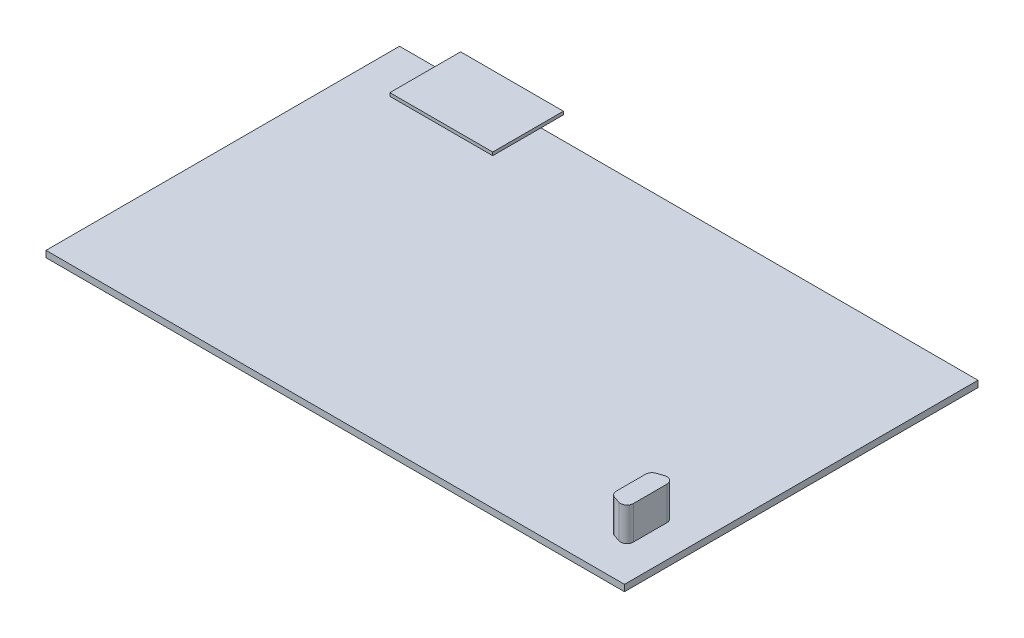
ISO-10303-21;
HEADER;
FILE_DESCRIPTION(('STEP AP214'),'2;1');
FILE_NAME('part.step','',(''),(''),'','','');
FILE_SCHEMA(('AUTOMOTIVE_DESIGN { 1 0 10303 214 1 1 1 1 }'));
ENDSEC;
DATA;
#1=APPLICATION_CONTEXT('core data for automotive mechanical design processes');
#2=APPLICATION_PROTOCOL_DEFINITION('international standard','automotive_design',2000,#1);
#3=PRODUCT_CONTEXT('',#1,'mechanical');
#4=PRODUCT('Part','Part','',(#3));
#5=PRODUCT_RELATED_PRODUCT_CATEGORY('part','',(#4));
#6=PRODUCT_DEFINITION_FORMATION('','',#4);
#7=PRODUCT_DEFINITION_CONTEXT('part definition',#1,'design');
#8=PRODUCT_DEFINITION('design','',#6,#7);
#9=PRODUCT_DEFINITION_SHAPE('','',#8);
#10=(LENGTH_UNIT() NAMED_UNIT(*) SI_UNIT(.MILLI.,.METRE.));
#11=(NAMED_UNIT(*) PLANE_ANGLE_UNIT() SI_UNIT($,.RADIAN.));
#12=(NAMED_UNIT(*) SI_UNIT($,.STERADIAN.) SOLID_ANGLE_UNIT());
#13=UNCERTAINTY_MEASURE_WITH_UNIT(LENGTH_MEASURE(1.E-05),#10,'distance_accuracy_value','');
#14=(GEOMETRIC_REPRESENTATION_CONTEXT(3) GLOBAL_UNCERTAINTY_ASSIGNED_CONTEXT((#13)) GLOBAL_UNIT_ASSIGNED_CONTEXT((#10,
#11,#12)) REPRESENTATION_CONTEXT('',''));
#15=CARTESIAN_POINT('',(0.,0.,0.));
#16=DIRECTION('',(0.,0.,1.));
#17=DIRECTION('',(1.,0.,0.));
#18=AXIS2_PLACEMENT_3D('',#15,#16,#17);
#19=CARTESIAN_POINT('',(0.,2.54,0.));
#20=DIRECTION('',(0.,1.,0.));
#21=DIRECTION('',(0.,0.,1.));
#22=AXIS2_PLACEMENT_3D('',#19,#20,#21);
#23=PLANE('',#22);
#24=DIRECTION('',(0.,0.,1.));
#25=VECTOR('',#24,1.);
#26=CARTESIAN_POINT('',(19.05,2.54,-158.75));
#27=LINE('',#26,#25);
#28=CARTESIAN_POINT('',(19.05,2.54,-158.75));
#29=VERTEX_POINT('',#28);
#30=CARTESIAN_POINT('',(19.05,2.54,-19.05));
#31=VERTEX_POINT('',#30);
#32=EDGE_CURVE('E234',#29,#31,#27,.T.);
#33=ORIENTED_EDGE('',*,*,#32,.T.);
#34=DIRECTION('',(1.,0.,0.));
#35=VECTOR('',#34,1.);
#36=CARTESIAN_POINT('',(19.05,2.54,-19.05));
#37=LINE('',#36,#35);
#38=CARTESIAN_POINT('',(247.65,2.54,-19.05));
#39=VERTEX_POINT('',#38);
#40=EDGE_CURVE('E237',#31,#39,#37,.T.);
#41=ORIENTED_EDGE('',*,*,#40,.T.);
#42=DIRECTION('',(0.,0.,-1.));
#43=VECTOR('',#42,1.);
#44=CARTESIAN_POINT('',(247.65,2.54,-158.75));
#45=LINE('',#44,#43);
#46=CARTESIAN_POINT('',(247.65,2.54,-158.75));
#47=VERTEX_POINT('',#46);
#48=EDGE_CURVE('E240',#39,#47,#45,.T.);
#49=ORIENTED_EDGE('',*,*,#48,.T.);
#50=DIRECTION('',(-1.,0.,0.));
#51=VECTOR('',#50,1.);
#52=CARTESIAN_POINT('',(19.05,2.54,-158.75));
#53=LINE('',#52,#51);
#54=EDGE_CURVE('E242',#47,#29,#53,.T.);
#55=ORIENTED_EDGE('',*,*,#54,.T.);
#56=EDGE_LOOP('',(#33,#41,#49,#55));
#57=FACE_BOUND('',#56,.T.);
#58=DIRECTION('',(1.,0.,0.));
#59=VECTOR('',#58,1.);
#60=CARTESIAN_POINT('',(40.64,2.54,-143.51));
#61=LINE('',#60,#59);
#62=CARTESIAN_POINT('',(40.64,2.54,-143.51));
#63=VERTEX_POINT('',#62);
#64=CARTESIAN_POINT('',(73.66,2.54,-143.51));
#65=VERTEX_POINT('',#64);
#66=EDGE_CURVE('E199',#63,#65,#61,.T.);
#67=ORIENTED_EDGE('',*,*,#66,.F.);
#68=DIRECTION('',(0.,0.,1.));
#69=VECTOR('',#68,1.);
#70=CARTESIAN_POINT('',(40.64,2.54,-148.59));
#71=LINE('',#70,#69);
#72=CARTESIAN_POINT('',(40.64,2.54,-148.59));
#73=VERTEX_POINT('',#72);
#74=EDGE_CURVE('E196',#73,#63,#71,.T.);
#75=ORIENTED_EDGE('',*,*,#74,.F.);
#76=DIRECTION('',(-1.,0.,0.));
#77=VECTOR('',#76,1.);
#78=CARTESIAN_POINT('',(40.64,2.54,-148.59));
#79=LINE('',#78,#77);
#80=CARTESIAN_POINT('',(73.66,2.54,-148.59));
#81=VERTEX_POINT('',#80);
#82=EDGE_CURVE('E209',#81,#73,#79,.T.);
#83=ORIENTED_EDGE('',*,*,#82,.F.);
#84=DIRECTION('',(0.,0.,-1.));
#85=VECTOR('',#84,1.);
#86=CARTESIAN_POINT('',(73.66,2.54,-148.59));
#87=LINE('',#86,#85);
#88=EDGE_CURVE('E220',#65,#81,#87,.T.);
#89=ORIENTED_EDGE('',*,*,#88,.F.);
#90=EDGE_LOOP('',(#67,#75,#83,#89));
#91=FACE_BOUND('',#90,.T.);
#92=DIRECTION('',(0.948683298050514,0.,0.316227766016838));
#93=VECTOR('',#92,1.);
#94=CARTESIAN_POINT('',(234.95,2.54,-31.75));
#95=LINE('',#94,#93);
#96=CARTESIAN_POINT('',(229.066781474317,2.54,-33.7110728418943));
#97=VERTEX_POINT('',#96);
#98=CARTESIAN_POINT('',(231.606781474317,2.54,-32.8644061752276));
#99=VERTEX_POINT('',#98);
#100=EDGE_CURVE('E296',#97,#99,#95,.T.);
#101=ORIENTED_EDGE('',*,*,#100,.F.);
#102=CARTESIAN_POINT('',(229.87,2.54,-36.1207284189426));
#103=DIRECTION('',(0.,1.,0.));
#104=DIRECTION('',(0.,0.,1.));
#105=AXIS2_PLACEMENT_3D('',#102,#103,#104);
#106=CIRCLE('',#105,2.54);
#107=CARTESIAN_POINT('',(227.33,2.54,-36.1207284189426));
#108=VERTEX_POINT('',#107);
#109=EDGE_CURVE('E43',#97,#108,#106,.F.);
#110=ORIENTED_EDGE('',*,*,#109,.T.);
#111=DIRECTION('',(0.,0.,1.));
#112=VECTOR('',#111,1.);
#113=CARTESIAN_POINT('',(227.33,2.54,-34.29));
#114=LINE('',#113,#112);
#115=CARTESIAN_POINT('',(227.33,2.54,-47.6992715810574));
#116=VERTEX_POINT('',#115);
#117=EDGE_CURVE('E295',#116,#108,#114,.T.);
#118=ORIENTED_EDGE('',*,*,#117,.F.);
#119=CARTESIAN_POINT('',(229.87,2.54,-47.6992715810574));
#120=DIRECTION('',(0.,1.,0.));
#121=DIRECTION('',(0.,0.,1.));
#122=AXIS2_PLACEMENT_3D('',#119,#120,#121);
#123=CIRCLE('',#122,2.54);
#124=CARTESIAN_POINT('',(229.066781474317,2.54,-50.1089271581057));
#125=VERTEX_POINT('',#124);
#126=EDGE_CURVE('E290',#116,#125,#123,.F.);
#127=ORIENTED_EDGE('',*,*,#126,.T.);
#128=DIRECTION('',(-0.948683298050513,0.,0.316227766016839));
#129=VECTOR('',#128,1.);
#130=CARTESIAN_POINT('',(227.33,2.54,-49.53));
#131=LINE('',#130,#129);
#132=CARTESIAN_POINT('',(231.606781474317,2.54,-50.9555938247724));
#133=VERTEX_POINT('',#132);
#134=EDGE_CURVE('E321',#133,#125,#131,.T.);
#135=ORIENTED_EDGE('',*,*,#134,.F.);
#136=CARTESIAN_POINT('',(232.41,2.54,-48.5459382477241));
#137=DIRECTION('',(0.,1.,0.));
#138=DIRECTION('',(0.,0.,1.));
#139=AXIS2_PLACEMENT_3D('',#136,#137,#138);
#140=CIRCLE('',#139,2.54);
#141=CARTESIAN_POINT('',(234.95,2.54,-48.5459382477241));
#142=VERTEX_POINT('',#141);
#143=EDGE_CURVE('E292',#133,#142,#140,.F.);
#144=ORIENTED_EDGE('',*,*,#143,.T.);
#145=DIRECTION('',(0.,0.,-1.));
#146=VECTOR('',#145,1.);
#147=CARTESIAN_POINT('',(234.95,2.54,-52.07));
#148=LINE('',#147,#146);
#149=CARTESIAN_POINT('',(234.95,2.54,-35.2740617522759));
#150=VERTEX_POINT('',#149);
#151=EDGE_CURVE('E326',#150,#142,#148,.T.);
#152=ORIENTED_EDGE('',*,*,#151,.F.);
#153=CARTESIAN_POINT('',(232.41,2.54,-35.2740617522759));
#154=DIRECTION('',(0.,1.,0.));
#155=DIRECTION('',(0.,0.,1.));
#156=AXIS2_PLACEMENT_3D('',#153,#154,#155);
#157=CIRCLE('',#156,2.54);
#158=EDGE_CURVE('E11',#150,#99,#157,.F.);
#159=ORIENTED_EDGE('',*,*,#158,.T.);
#160=EDGE_LOOP('',(#101,#110,#118,#127,#135,#144,#152,#159));
#161=FACE_BOUND('',#160,.T.);
#162=ADVANCED_FACE('F35',(#57,#91,#161),#23,.T.);
#163=CARTESIAN_POINT('',(19.05,2.54,-158.75));
#164=DIRECTION('',(1.,0.,0.));
#165=DIRECTION('',(0.,0.,-1.));
#166=AXIS2_PLACEMENT_3D('',#163,#164,#165);
#167=PLANE('',#166);
#168=DIRECTION('',(0.,0.,1.));
#169=VECTOR('',#168,1.);
#170=CARTESIAN_POINT('',(19.05,0.,-158.75));
#171=LINE('',#170,#169);
#172=CARTESIAN_POINT('',(19.05,0.,-158.75));
#173=VERTEX_POINT('',#172);
#174=CARTESIAN_POINT('',(19.05,0.,-19.05));
#175=VERTEX_POINT('',#174);
#176=EDGE_CURVE('E233',#173,#175,#171,.T.);
#177=ORIENTED_EDGE('',*,*,#176,.T.);
#178=DIRECTION('',(0.,-1.,0.));
#179=VECTOR('',#178,1.);
#180=CARTESIAN_POINT('',(19.05,2.54,-19.05));
#181=LINE('',#180,#179);
#182=EDGE_CURVE('E260',#31,#175,#181,.T.);
#183=ORIENTED_EDGE('',*,*,#182,.F.);
#184=ORIENTED_EDGE('',*,*,#32,.F.);
#185=DIRECTION('',(0.,-1.,0.));
#186=VECTOR('',#185,1.);
#187=CARTESIAN_POINT('',(19.05,2.54,-158.75));
#188=LINE('',#187,#186);
#189=EDGE_CURVE('E244',#29,#173,#188,.T.);
#190=ORIENTED_EDGE('',*,*,#189,.T.);
#191=EDGE_LOOP('',(#177,#183,#184,#190));
#192=FACE_BOUND('',#191,.T.);
#193=ADVANCED_FACE('F360',(#192),#167,.F.);
#194=CARTESIAN_POINT('',(19.05,2.54,-19.05));
#195=DIRECTION('',(0.,0.,-1.));
#196=DIRECTION('',(-1.,0.,0.));
#197=AXIS2_PLACEMENT_3D('',#194,#195,#196);
#198=PLANE('',#197);
#199=DIRECTION('',(1.,0.,0.));
#200=VECTOR('',#199,1.);
#201=CARTESIAN_POINT('',(19.05,0.,-19.05));
#202=LINE('',#201,#200);
#203=CARTESIAN_POINT('',(247.65,0.,-19.05));
#204=VERTEX_POINT('',#203);
#205=EDGE_CURVE('E247',#175,#204,#202,.T.);
#206=ORIENTED_EDGE('',*,*,#205,.T.);
#207=DIRECTION('',(0.,-1.,0.));
#208=VECTOR('',#207,1.);
#209=CARTESIAN_POINT('',(247.65,2.54,-19.05));
#210=LINE('',#209,#208);
#211=EDGE_CURVE('E257',#39,#204,#210,.T.);
#212=ORIENTED_EDGE('',*,*,#211,.F.);
#213=ORIENTED_EDGE('',*,*,#40,.F.);
#214=ORIENTED_EDGE('',*,*,#182,.T.);
#215=EDGE_LOOP('',(#206,#212,#213,#214));
#216=FACE_BOUND('',#215,.T.);
#217=ADVANCED_FACE('F366',(#216),#198,.F.);
#218=CARTESIAN_POINT('',(247.65,2.54,-158.75));
#219=DIRECTION('',(-1.,0.,0.));
#220=DIRECTION('',(0.,0.,1.));
#221=AXIS2_PLACEMENT_3D('',#218,#219,#220);
#222=PLANE('',#221);
#223=DIRECTION('',(0.,0.,-1.));
#224=VECTOR('',#223,1.);
#225=CARTESIAN_POINT('',(247.65,0.,-158.75));
#226=LINE('',#225,#224);
#227=CARTESIAN_POINT('',(247.65,0.,-158.75));
#228=VERTEX_POINT('',#227);
#229=EDGE_CURVE('E249',#204,#228,#226,.T.);
#230=ORIENTED_EDGE('',*,*,#229,.T.);
#231=DIRECTION('',(0.,-1.,0.));
#232=VECTOR('',#231,1.);
#233=CARTESIAN_POINT('',(247.65,2.54,-158.75));
#234=LINE('',#233,#232);
#235=EDGE_CURVE('E254',#47,#228,#234,.T.);
#236=ORIENTED_EDGE('',*,*,#235,.F.);
#237=ORIENTED_EDGE('',*,*,#48,.F.);
#238=ORIENTED_EDGE('',*,*,#211,.T.);
#239=EDGE_LOOP('',(#230,#236,#237,#238));
#240=FACE_BOUND('',#239,.T.);
#241=ADVANCED_FACE('F381',(#240),#222,.F.);
#242=CARTESIAN_POINT('',(19.05,2.54,-158.75));
#243=DIRECTION('',(0.,0.,1.));
#244=DIRECTION('',(1.,0.,0.));
#245=AXIS2_PLACEMENT_3D('',#242,#243,#244);
#246=PLANE('',#245);
#247=DIRECTION('',(-1.,0.,0.));
#248=VECTOR('',#247,1.);
#249=CARTESIAN_POINT('',(19.05,0.,-158.75));
#250=LINE('',#249,#248);
#251=EDGE_CURVE('E238',#228,#173,#250,.T.);
#252=ORIENTED_EDGE('',*,*,#251,.T.);
#253=ORIENTED_EDGE('',*,*,#189,.F.);
#254=ORIENTED_EDGE('',*,*,#54,.F.);
#255=ORIENTED_EDGE('',*,*,#235,.T.);
#256=EDGE_LOOP('',(#252,#253,#254,#255));
#257=FACE_BOUND('',#256,.T.);
#258=ADVANCED_FACE('F377',(#257),#246,.F.);
#259=CARTESIAN_POINT('',(0.,0.,0.));
#260=DIRECTION('',(0.,1.,0.));
#261=DIRECTION('',(0.,0.,1.));
#262=AXIS2_PLACEMENT_3D('',#259,#260,#261);
#263=PLANE('',#262);
#264=ORIENTED_EDGE('',*,*,#176,.F.);
#265=ORIENTED_EDGE('',*,*,#251,.F.);
#266=ORIENTED_EDGE('',*,*,#229,.F.);
#267=ORIENTED_EDGE('',*,*,#205,.F.);
#268=EDGE_LOOP('',(#264,#265,#266,#267));
#269=FACE_BOUND('',#268,.T.);
#270=ADVANCED_FACE('F374',(#269),#263,.F.);
#271=CARTESIAN_POINT('',(40.64,5.08,-148.59));
#272=DIRECTION('',(1.,0.,0.));
#273=DIRECTION('',(0.,0.,-1.));
#274=AXIS2_PLACEMENT_3D('',#271,#272,#273);
#275=PLANE('',#274);
#276=ORIENTED_EDGE('',*,*,#74,.T.);
#277=DIRECTION('',(0.,-1.,0.));
#278=VECTOR('',#277,1.);
#279=CARTESIAN_POINT('',(40.64,5.08,-143.51));
#280=LINE('',#279,#278);
#281=CARTESIAN_POINT('',(40.64,5.08,-143.51));
#282=VERTEX_POINT('',#281);
#283=EDGE_CURVE('E231',#282,#63,#280,.T.);
#284=ORIENTED_EDGE('',*,*,#283,.F.);
#285=DIRECTION('',(0.,0.,1.));
#286=VECTOR('',#285,1.);
#287=CARTESIAN_POINT('',(40.64,5.08,-148.59));
#288=LINE('',#287,#286);
#289=CARTESIAN_POINT('',(40.64,5.08,-148.59));
#290=VERTEX_POINT('',#289);
#291=EDGE_CURVE('E205',#290,#282,#288,.T.);
#292=ORIENTED_EDGE('',*,*,#291,.F.);
#293=DIRECTION('',(0.,-1.,0.));
#294=VECTOR('',#293,1.);
#295=CARTESIAN_POINT('',(40.64,5.08,-148.59));
#296=LINE('',#295,#294);
#297=EDGE_CURVE('E217',#290,#73,#296,.T.);
#298=ORIENTED_EDGE('',*,*,#297,.T.);
#299=EDGE_LOOP('',(#276,#284,#292,#298));
#300=FACE_BOUND('',#299,.T.);
#301=ADVANCED_FACE('F372',(#300),#275,.F.);
#302=CARTESIAN_POINT('',(40.64,5.08,-143.51));
#303=DIRECTION('',(0.,0.,-1.));
#304=DIRECTION('',(-1.,0.,0.));
#305=AXIS2_PLACEMENT_3D('',#302,#303,#304);
#306=PLANE('',#305);
#307=ORIENTED_EDGE('',*,*,#66,.T.);
#308=DIRECTION('',(0.,-1.,0.));
#309=VECTOR('',#308,1.);
#310=CARTESIAN_POINT('',(73.66,5.08,-143.51));
#311=LINE('',#310,#309);
#312=CARTESIAN_POINT('',(73.66,5.08,-143.51));
#313=VERTEX_POINT('',#312);
#314=EDGE_CURVE('E228',#313,#65,#311,.T.);
#315=ORIENTED_EDGE('',*,*,#314,.F.);
#316=DIRECTION('',(1.,0.,0.));
#317=VECTOR('',#316,1.);
#318=CARTESIAN_POINT('',(40.64,5.08,-143.51));
#319=LINE('',#318,#317);
#320=EDGE_CURVE('E208',#282,#313,#319,.T.);
#321=ORIENTED_EDGE('',*,*,#320,.F.);
#322=ORIENTED_EDGE('',*,*,#283,.T.);
#323=EDGE_LOOP('',(#307,#315,#321,#322));
#324=FACE_BOUND('',#323,.T.);
#325=ADVANCED_FACE('F444',(#324),#306,.F.);
#326=CARTESIAN_POINT('',(73.66,5.08,-148.59));
#327=DIRECTION('',(-1.,0.,0.));
#328=DIRECTION('',(0.,0.,1.));
#329=AXIS2_PLACEMENT_3D('',#326,#327,#328);
#330=PLANE('',#329);
#331=ORIENTED_EDGE('',*,*,#88,.T.);
#332=DIRECTION('',(0.,-1.,0.));
#333=VECTOR('',#332,1.);
#334=CARTESIAN_POINT('',(73.66,5.08,-148.59));
#335=LINE('',#334,#333);
#336=CARTESIAN_POINT('',(73.66,5.08,-148.59));
#337=VERTEX_POINT('',#336);
#338=EDGE_CURVE('E226',#337,#81,#335,.T.);
#339=ORIENTED_EDGE('',*,*,#338,.F.);
#340=DIRECTION('',(0.,0.,-1.));
#341=VECTOR('',#340,1.);
#342=CARTESIAN_POINT('',(73.66,5.08,-148.59));
#343=LINE('',#342,#341);
#344=EDGE_CURVE('E212',#313,#337,#343,.T.);
#345=ORIENTED_EDGE('',*,*,#344,.F.);
#346=ORIENTED_EDGE('',*,*,#314,.T.);
#347=EDGE_LOOP('',(#331,#339,#345,#346));
#348=FACE_BOUND('',#347,.T.);
#349=ADVANCED_FACE('F438',(#348),#330,.F.);
#350=CARTESIAN_POINT('',(40.64,5.08,-148.59));
#351=DIRECTION('',(0.,0.,1.));
#352=DIRECTION('',(1.,0.,0.));
#353=AXIS2_PLACEMENT_3D('',#350,#351,#352);
#354=PLANE('',#353);
#355=ORIENTED_EDGE('',*,*,#82,.T.);
#356=ORIENTED_EDGE('',*,*,#297,.F.);
#357=DIRECTION('',(-1.,0.,0.));
#358=VECTOR('',#357,1.);
#359=CARTESIAN_POINT('',(40.64,5.08,-148.59));
#360=LINE('',#359,#358);
#361=EDGE_CURVE('E215',#337,#290,#360,.T.);
#362=ORIENTED_EDGE('',*,*,#361,.F.);
#363=ORIENTED_EDGE('',*,*,#338,.T.);
#364=EDGE_LOOP('',(#355,#356,#362,#363));
#365=FACE_BOUND('',#364,.T.);
#366=ADVANCED_FACE('F432',(#365),#354,.F.);
#367=CARTESIAN_POINT('',(0.,5.08,0.));
#368=DIRECTION('',(0.,1.,0.));
#369=DIRECTION('',(0.,0.,1.));
#370=AXIS2_PLACEMENT_3D('',#367,#368,#369);
#371=PLANE('',#370);
#372=DIRECTION('',(0.,0.,1.));
#373=VECTOR('',#372,1.);
#374=CARTESIAN_POINT('',(36.83,5.08,-165.1));
#375=LINE('',#374,#373);
#376=CARTESIAN_POINT('',(36.83,5.08,-165.1));
#377=VERTEX_POINT('',#376);
#378=CARTESIAN_POINT('',(36.83,5.08,-137.16));
#379=VERTEX_POINT('',#378);
#380=EDGE_CURVE('E195',#377,#379,#375,.T.);
#381=ORIENTED_EDGE('',*,*,#380,.F.);
#382=DIRECTION('',(-1.,0.,0.));
#383=VECTOR('',#382,1.);
#384=CARTESIAN_POINT('',(36.83,5.08,-165.1));
#385=LINE('',#384,#383);
#386=CARTESIAN_POINT('',(77.47,5.08,-165.1));
#387=VERTEX_POINT('',#386);
#388=EDGE_CURVE('E191',#387,#377,#385,.T.);
#389=ORIENTED_EDGE('',*,*,#388,.F.);
#390=DIRECTION('',(0.,0.,-1.));
#391=VECTOR('',#390,1.);
#392=CARTESIAN_POINT('',(77.47,5.08,-165.1));
#393=LINE('',#392,#391);
#394=CARTESIAN_POINT('',(77.47,5.08,-137.16));
#395=VERTEX_POINT('',#394);
#396=EDGE_CURVE('E337',#395,#387,#393,.T.);
#397=ORIENTED_EDGE('',*,*,#396,.F.);
#398=DIRECTION('',(1.,0.,0.));
#399=VECTOR('',#398,1.);
#400=CARTESIAN_POINT('',(36.83,5.08,-137.16));
#401=LINE('',#400,#399);
#402=EDGE_CURVE('E335',#379,#395,#401,.T.);
#403=ORIENTED_EDGE('',*,*,#402,.F.);
#404=EDGE_LOOP('',(#381,#389,#397,#403));
#405=FACE_BOUND('',#404,.T.);
#406=ORIENTED_EDGE('',*,*,#361,.T.);
#407=ORIENTED_EDGE('',*,*,#291,.T.);
#408=ORIENTED_EDGE('',*,*,#320,.T.);
#409=ORIENTED_EDGE('',*,*,#344,.T.);
#410=EDGE_LOOP('',(#406,#407,#408,#409));
#411=FACE_BOUND('',#410,.T.);
#412=ADVANCED_FACE('F348',(#405,#411),#371,.F.);
#413=CARTESIAN_POINT('',(36.83,6.35,-165.1));
#414=DIRECTION('',(1.,0.,0.));
#415=DIRECTION('',(0.,0.,-1.));
#416=AXIS2_PLACEMENT_3D('',#413,#414,#415);
#417=PLANE('',#416);
#418=ORIENTED_EDGE('',*,*,#380,.T.);
#419=DIRECTION('',(0.,-1.,0.));
#420=VECTOR('',#419,1.);
#421=CARTESIAN_POINT('',(36.83,6.35,-137.16));
#422=LINE('',#421,#420);
#423=CARTESIAN_POINT('',(36.83,6.35,-137.16));
#424=VERTEX_POINT('',#423);
#425=EDGE_CURVE('E175',#424,#379,#422,.T.);
#426=ORIENTED_EDGE('',*,*,#425,.F.);
#427=DIRECTION('',(0.,0.,1.));
#428=VECTOR('',#427,1.);
#429=CARTESIAN_POINT('',(36.83,6.35,-165.1));
#430=LINE('',#429,#428);
#431=CARTESIAN_POINT('',(36.83,6.35,-165.1));
#432=VERTEX_POINT('',#431);
#433=EDGE_CURVE('E182',#432,#424,#430,.T.);
#434=ORIENTED_EDGE('',*,*,#433,.F.);
#435=DIRECTION('',(0.,-1.,0.));
#436=VECTOR('',#435,1.);
#437=CARTESIAN_POINT('',(36.83,6.35,-165.1));
#438=LINE('',#437,#436);
#439=EDGE_CURVE('E333',#432,#377,#438,.T.);
#440=ORIENTED_EDGE('',*,*,#439,.T.);
#441=EDGE_LOOP('',(#418,#426,#434,#440));
#442=FACE_BOUND('',#441,.T.);
#443=ADVANCED_FACE('F193',(#442),#417,.F.);
#444=CARTESIAN_POINT('',(36.83,6.35,-137.16));
#445=DIRECTION('',(0.,0.,-1.));
#446=DIRECTION('',(-1.,0.,0.));
#447=AXIS2_PLACEMENT_3D('',#444,#445,#446);
#448=PLANE('',#447);
#449=ORIENTED_EDGE('',*,*,#402,.T.);
#450=DIRECTION('',(0.,-1.,0.));
#451=VECTOR('',#450,1.);
#452=CARTESIAN_POINT('',(77.47,6.35,-137.16));
#453=LINE('',#452,#451);
#454=CARTESIAN_POINT('',(77.47,6.35,-137.16));
#455=VERTEX_POINT('',#454);
#456=EDGE_CURVE('E178',#455,#395,#453,.T.);
#457=ORIENTED_EDGE('',*,*,#456,.F.);
#458=DIRECTION('',(1.,0.,0.));
#459=VECTOR('',#458,1.);
#460=CARTESIAN_POINT('',(36.83,6.35,-137.16));
#461=LINE('',#460,#459);
#462=EDGE_CURVE('E171',#424,#455,#461,.T.);
#463=ORIENTED_EDGE('',*,*,#462,.F.);
#464=ORIENTED_EDGE('',*,*,#425,.T.);
#465=EDGE_LOOP('',(#449,#457,#463,#464));
#466=FACE_BOUND('',#465,.T.);
#467=ADVANCED_FACE('F173',(#466),#448,.F.);
#468=CARTESIAN_POINT('',(77.47,6.35,-165.1));
#469=DIRECTION('',(-1.,0.,0.));
#470=DIRECTION('',(0.,0.,1.));
#471=AXIS2_PLACEMENT_3D('',#468,#469,#470);
#472=PLANE('',#471);
#473=ORIENTED_EDGE('',*,*,#396,.T.);
#474=DIRECTION('',(0.,-1.,0.));
#475=VECTOR('',#474,1.);
#476=CARTESIAN_POINT('',(77.47,6.35,-165.1));
#477=LINE('',#476,#475);
#478=CARTESIAN_POINT('',(77.47,6.35,-165.1));
#479=VERTEX_POINT('',#478);
#480=EDGE_CURVE('E201',#479,#387,#477,.T.);
#481=ORIENTED_EDGE('',*,*,#480,.F.);
#482=DIRECTION('',(0.,0.,-1.));
#483=VECTOR('',#482,1.);
#484=CARTESIAN_POINT('',(77.47,6.35,-165.1));
#485=LINE('',#484,#483);
#486=EDGE_CURVE('E181',#455,#479,#485,.T.);
#487=ORIENTED_EDGE('',*,*,#486,.F.);
#488=ORIENTED_EDGE('',*,*,#456,.T.);
#489=EDGE_LOOP('',(#473,#481,#487,#488));
#490=FACE_BOUND('',#489,.T.);
#491=ADVANCED_FACE('F350',(#490),#472,.F.);
#492=CARTESIAN_POINT('',(36.83,6.35,-165.1));
#493=DIRECTION('',(0.,0.,1.));
#494=DIRECTION('',(1.,0.,0.));
#495=AXIS2_PLACEMENT_3D('',#492,#493,#494);
#496=PLANE('',#495);
#497=ORIENTED_EDGE('',*,*,#388,.T.);
#498=ORIENTED_EDGE('',*,*,#439,.F.);
#499=DIRECTION('',(-1.,0.,0.));
#500=VECTOR('',#499,1.);
#501=CARTESIAN_POINT('',(36.83,6.35,-165.1));
#502=LINE('',#501,#500);
#503=EDGE_CURVE('E187',#479,#432,#502,.T.);
#504=ORIENTED_EDGE('',*,*,#503,.F.);
#505=ORIENTED_EDGE('',*,*,#480,.T.);
#506=EDGE_LOOP('',(#497,#498,#504,#505));
#507=FACE_BOUND('',#506,.T.);
#508=ADVANCED_FACE('F344',(#507),#496,.F.);
#509=CARTESIAN_POINT('',(0.,6.35,0.));
#510=DIRECTION('',(0.,1.,0.));
#511=DIRECTION('',(0.,0.,1.));
#512=AXIS2_PLACEMENT_3D('',#509,#510,#511);
#513=PLANE('',#512);
#514=ORIENTED_EDGE('',*,*,#433,.T.);
#515=ORIENTED_EDGE('',*,*,#462,.T.);
#516=ORIENTED_EDGE('',*,*,#486,.T.);
#517=ORIENTED_EDGE('',*,*,#503,.T.);
#518=EDGE_LOOP('',(#514,#515,#516,#517));
#519=FACE_BOUND('',#518,.T.);
#520=ADVANCED_FACE('F185',(#519),#513,.T.);
#521=CARTESIAN_POINT('',(227.33,15.748,-34.29));
#522=DIRECTION('',(1.,0.,0.));
#523=DIRECTION('',(0.,0.,-1.));
#524=AXIS2_PLACEMENT_3D('',#521,#522,#523);
#525=PLANE('',#524);
#526=DIRECTION('',(0.,0.,1.));
#527=VECTOR('',#526,1.);
#528=CARTESIAN_POINT('',(227.33,15.748,-34.29));
#529=LINE('',#528,#527);
#530=CARTESIAN_POINT('',(227.33,15.748,-47.6992715810574));
#531=VERTEX_POINT('',#530);
#532=CARTESIAN_POINT('',(227.33,15.748,-36.1207284189426));
#533=VERTEX_POINT('',#532);
#534=EDGE_CURVE('E312',#531,#533,#529,.T.);
#535=ORIENTED_EDGE('',*,*,#534,.F.);
#536=DIRECTION('',(0.,-1.,0.));
#537=VECTOR('',#536,1.);
#538=CARTESIAN_POINT('',(227.33,15.748,-47.6992715810574));
#539=LINE('',#538,#537);
#540=EDGE_CURVE('E265',#531,#116,#539,.T.);
#541=ORIENTED_EDGE('',*,*,#540,.T.);
#542=ORIENTED_EDGE('',*,*,#117,.T.);
#543=DIRECTION('',(0.,-1.,0.));
#544=VECTOR('',#543,1.);
#545=CARTESIAN_POINT('',(227.33,15.748,-36.1207284189426));
#546=LINE('',#545,#544);
#547=EDGE_CURVE('E263',#108,#533,#546,.F.);
#548=ORIENTED_EDGE('',*,*,#547,.T.);
#549=EDGE_LOOP('',(#535,#541,#542,#548));
#550=FACE_BOUND('',#549,.T.);
#551=ADVANCED_FACE('F299',(#550),#525,.F.);
#552=CARTESIAN_POINT('',(234.95,15.748,-31.75));
#553=DIRECTION('',(0.316227766016838,0.,-0.948683298050514));
#554=DIRECTION('',(-0.948683298050514,0.,-0.316227766016838));
#555=AXIS2_PLACEMENT_3D('',#552,#553,#554);
#556=PLANE('',#555);
#557=DIRECTION('',(0.948683298050514,0.,0.316227766016838));
#558=VECTOR('',#557,1.);
#559=CARTESIAN_POINT('',(234.95,15.748,-31.75));
#560=LINE('',#559,#558);
#561=CARTESIAN_POINT('',(229.066781474317,15.748,-33.7110728418943));
#562=VERTEX_POINT('',#561);
#563=CARTESIAN_POINT('',(231.606781474317,15.748,-32.8644061752276));
#564=VERTEX_POINT('',#563);
#565=EDGE_CURVE('E310',#562,#564,#560,.T.);
#566=ORIENTED_EDGE('',*,*,#565,.F.);
#567=DIRECTION('',(0.,-1.,0.));
#568=VECTOR('',#567,1.);
#569=CARTESIAN_POINT('',(229.066781474317,15.748,-33.7110728418943));
#570=LINE('',#569,#568);
#571=EDGE_CURVE('E288',#562,#97,#570,.T.);
#572=ORIENTED_EDGE('',*,*,#571,.T.);
#573=ORIENTED_EDGE('',*,*,#100,.T.);
#574=DIRECTION('',(0.,-1.,0.));
#575=VECTOR('',#574,1.);
#576=CARTESIAN_POINT('',(231.606781474317,15.748,-32.8644061752276));
#577=LINE('',#576,#575);
#578=EDGE_CURVE('E286',#99,#564,#577,.F.);
#579=ORIENTED_EDGE('',*,*,#578,.T.);
#580=EDGE_LOOP('',(#566,#572,#573,#579));
#581=FACE_BOUND('',#580,.T.);
#582=ADVANCED_FACE('F314',(#581),#556,.F.);
#583=CARTESIAN_POINT('',(234.95,15.748,-52.07));
#584=DIRECTION('',(-1.,0.,0.));
#585=DIRECTION('',(0.,0.,1.));
#586=AXIS2_PLACEMENT_3D('',#583,#584,#585);
#587=PLANE('',#586);
#588=ORIENTED_EDGE('',*,*,#151,.T.);
#589=DIRECTION('',(0.,-1.,0.));
#590=VECTOR('',#589,1.);
#591=CARTESIAN_POINT('',(234.95,15.748,-48.5459382477241));
#592=LINE('',#591,#590);
#593=CARTESIAN_POINT('',(234.95,15.748,-48.5459382477241));
#594=VERTEX_POINT('',#593);
#595=EDGE_CURVE('E284',#142,#594,#592,.F.);
#596=ORIENTED_EDGE('',*,*,#595,.T.);
#597=DIRECTION('',(0.,0.,-1.));
#598=VECTOR('',#597,1.);
#599=CARTESIAN_POINT('',(234.95,15.748,-52.07));
#600=LINE('',#599,#598);
#601=CARTESIAN_POINT('',(234.95,15.748,-35.2740617522759));
#602=VERTEX_POINT('',#601);
#603=EDGE_CURVE('E316',#602,#594,#600,.T.);
#604=ORIENTED_EDGE('',*,*,#603,.F.);
#605=DIRECTION('',(0.,-1.,0.));
#606=VECTOR('',#605,1.);
#607=CARTESIAN_POINT('',(234.95,15.748,-35.2740617522759));
#608=LINE('',#607,#606);
#609=EDGE_CURVE('E281',#602,#150,#608,.T.);
#610=ORIENTED_EDGE('',*,*,#609,.T.);
#611=EDGE_LOOP('',(#588,#596,#604,#610));
#612=FACE_BOUND('',#611,.T.);
#613=ADVANCED_FACE('F407',(#612),#587,.F.);
#614=CARTESIAN_POINT('',(227.33,15.748,-49.53));
#615=DIRECTION('',(0.316227766016839,0.,0.948683298050513));
#616=DIRECTION('',(0.948683298050513,0.,-0.316227766016839));
#617=AXIS2_PLACEMENT_3D('',#614,#615,#616);
#618=PLANE('',#617);
#619=ORIENTED_EDGE('',*,*,#134,.T.);
#620=DIRECTION('',(0.,-1.,0.));
#621=VECTOR('',#620,1.);
#622=CARTESIAN_POINT('',(229.066781474317,15.748,-50.1089271581057));
#623=LINE('',#622,#621);
#624=CARTESIAN_POINT('',(229.066781474317,15.748,-50.1089271581057));
#625=VERTEX_POINT('',#624);
#626=EDGE_CURVE('E271',#125,#625,#623,.F.);
#627=ORIENTED_EDGE('',*,*,#626,.T.);
#628=DIRECTION('',(-0.948683298050513,0.,0.316227766016839));
#629=VECTOR('',#628,1.);
#630=CARTESIAN_POINT('',(227.33,15.748,-49.53));
#631=LINE('',#630,#629);
#632=CARTESIAN_POINT('',(231.606781474317,15.748,-50.9555938247724));
#633=VERTEX_POINT('',#632);
#634=EDGE_CURVE('E319',#633,#625,#631,.T.);
#635=ORIENTED_EDGE('',*,*,#634,.F.);
#636=DIRECTION('',(0.,-1.,0.));
#637=VECTOR('',#636,1.);
#638=CARTESIAN_POINT('',(231.606781474317,15.748,-50.9555938247724));
#639=LINE('',#638,#637);
#640=EDGE_CURVE('E268',#633,#133,#639,.T.);
#641=ORIENTED_EDGE('',*,*,#640,.T.);
#642=EDGE_LOOP('',(#619,#627,#635,#641));
#643=FACE_BOUND('',#642,.T.);
#644=ADVANCED_FACE('F413',(#643),#618,.F.);
#645=CARTESIAN_POINT('',(0.,15.748,0.));
#646=DIRECTION('',(0.,-1.,0.));
#647=DIRECTION('',(0.,0.,-1.));
#648=AXIS2_PLACEMENT_3D('',#645,#646,#647);
#649=PLANE('',#648);
#650=ORIENTED_EDGE('',*,*,#634,.T.);
#651=CARTESIAN_POINT('',(229.87,15.748,-47.6992715810574));
#652=DIRECTION('',(0.,-1.,0.));
#653=DIRECTION('',(0.,0.,-1.));
#654=AXIS2_PLACEMENT_3D('',#651,#652,#653);
#655=CIRCLE('',#654,2.54);
#656=EDGE_CURVE('E279',#625,#531,#655,.F.);
#657=ORIENTED_EDGE('',*,*,#656,.T.);
#658=ORIENTED_EDGE('',*,*,#534,.T.);
#659=CARTESIAN_POINT('',(229.87,15.748,-36.1207284189426));
#660=DIRECTION('',(0.,-1.,0.));
#661=DIRECTION('',(0.,0.,-1.));
#662=AXIS2_PLACEMENT_3D('',#659,#660,#661);
#663=CIRCLE('',#662,2.54);
#664=EDGE_CURVE('E275',#533,#562,#663,.F.);
#665=ORIENTED_EDGE('',*,*,#664,.T.);
#666=ORIENTED_EDGE('',*,*,#565,.T.);
#667=CARTESIAN_POINT('',(232.41,15.748,-35.2740617522759));
#668=DIRECTION('',(0.,-1.,0.));
#669=DIRECTION('',(0.,0.,-1.));
#670=AXIS2_PLACEMENT_3D('',#667,#668,#669);
#671=CIRCLE('',#670,2.54);
#672=EDGE_CURVE('E273',#564,#602,#671,.F.);
#673=ORIENTED_EDGE('',*,*,#672,.T.);
#674=ORIENTED_EDGE('',*,*,#603,.T.);
#675=CARTESIAN_POINT('',(232.41,15.748,-48.5459382477241));
#676=DIRECTION('',(0.,-1.,0.));
#677=DIRECTION('',(0.,0.,-1.));
#678=AXIS2_PLACEMENT_3D('',#675,#676,#677);
#679=CIRCLE('',#678,2.54);
#680=EDGE_CURVE('E277',#594,#633,#679,.F.);
#681=ORIENTED_EDGE('',*,*,#680,.T.);
#682=EDGE_LOOP('',(#650,#657,#658,#665,#666,#673,#674,#681));
#683=FACE_BOUND('',#682,.T.);
#684=ADVANCED_FACE('F309',(#683),#649,.F.);
#685=CARTESIAN_POINT('',(229.87,15.748,-47.6992715810574));
#686=DIRECTION('',(0.,-1.,0.));
#687=DIRECTION('',(0.,0.,-1.));
#688=AXIS2_PLACEMENT_3D('',#685,#686,#687);
#689=CYLINDRICAL_SURFACE('',#688,2.54);
#690=ORIENTED_EDGE('',*,*,#656,.F.);
#691=ORIENTED_EDGE('',*,*,#626,.F.);
#692=ORIENTED_EDGE('',*,*,#126,.F.);
#693=ORIENTED_EDGE('',*,*,#540,.F.);
#694=EDGE_LOOP('',(#690,#691,#692,#693));
#695=FACE_BOUND('',#694,.T.);
#696=ADVANCED_FACE('F389',(#695),#689,.T.);
#697=CARTESIAN_POINT('',(232.41,15.748,-48.5459382477241));
#698=DIRECTION('',(0.,-1.,0.));
#699=DIRECTION('',(0.,0.,-1.));
#700=AXIS2_PLACEMENT_3D('',#697,#698,#699);
#701=CYLINDRICAL_SURFACE('',#700,2.54);
#702=ORIENTED_EDGE('',*,*,#680,.F.);
#703=ORIENTED_EDGE('',*,*,#595,.F.);
#704=ORIENTED_EDGE('',*,*,#143,.F.);
#705=ORIENTED_EDGE('',*,*,#640,.F.);
#706=EDGE_LOOP('',(#702,#703,#704,#705));
#707=FACE_BOUND('',#706,.T.);
#708=ADVANCED_FACE('F392',(#707),#701,.T.);
#709=CARTESIAN_POINT('',(229.87,15.748,-36.1207284189426));
#710=DIRECTION('',(0.,-1.,0.));
#711=DIRECTION('',(0.,0.,-1.));
#712=AXIS2_PLACEMENT_3D('',#709,#710,#711);
#713=CYLINDRICAL_SURFACE('',#712,2.54);
#714=ORIENTED_EDGE('',*,*,#664,.F.);
#715=ORIENTED_EDGE('',*,*,#547,.F.);
#716=ORIENTED_EDGE('',*,*,#109,.F.);
#717=ORIENTED_EDGE('',*,*,#571,.F.);
#718=EDGE_LOOP('',(#714,#715,#716,#717));
#719=FACE_BOUND('',#718,.T.);
#720=ADVANCED_FACE('F304',(#719),#713,.T.);
#721=CARTESIAN_POINT('',(232.41,15.748,-35.2740617522759));
#722=DIRECTION('',(0.,-1.,0.));
#723=DIRECTION('',(0.,0.,-1.));
#724=AXIS2_PLACEMENT_3D('',#721,#722,#723);
#725=CYLINDRICAL_SURFACE('',#724,2.54);
#726=ORIENTED_EDGE('',*,*,#672,.F.);
#727=ORIENTED_EDGE('',*,*,#578,.F.);
#728=ORIENTED_EDGE('',*,*,#158,.F.);
#729=ORIENTED_EDGE('',*,*,#609,.F.);
#730=EDGE_LOOP('',(#726,#727,#728,#729));
#731=FACE_BOUND('',#730,.T.);
#732=ADVANCED_FACE('F37',(#731),#725,.T.);
#733=CLOSED_SHELL('',(#162,#193,#217,#241,#258,#270,#301,#325,#349,#366,#412,#443,#467,#491,
#508,#520,#551,#582,#613,#644,#684,#696,#708,#720,#732));
#734=MANIFOLD_SOLID_BREP('B2',#733);
#735=ADVANCED_BREP_SHAPE_REPRESENTATION('',(#18,#734),#14);
#736=SHAPE_DEFINITION_REPRESENTATION(#9,#735);
ENDSEC;
END-ISO-10303-21;
